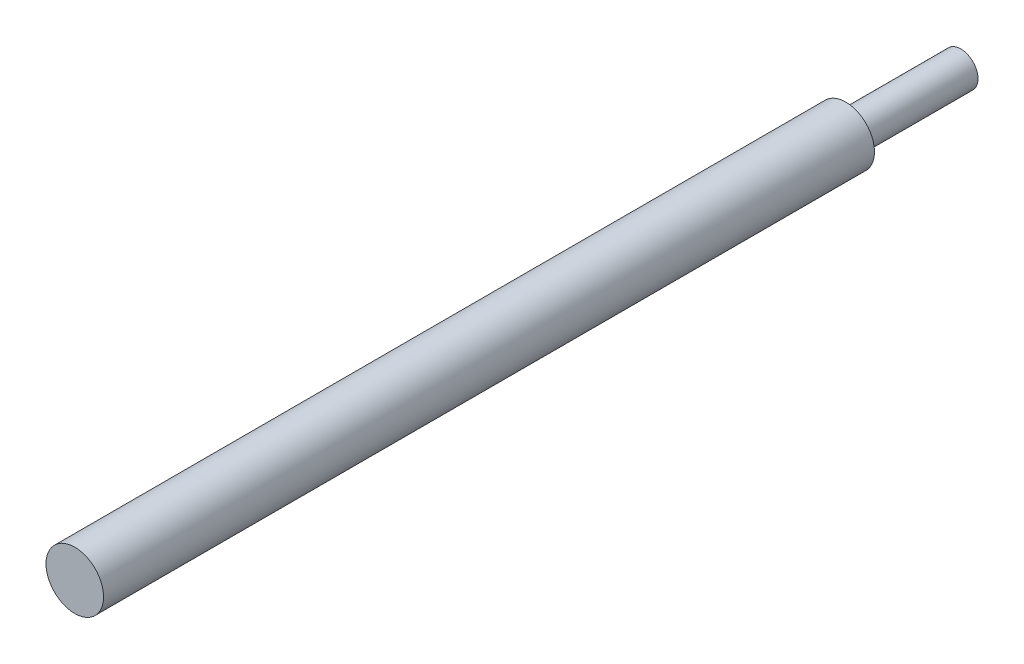
ISO-10303-21;
HEADER;
FILE_DESCRIPTION(('STEP AP214'),'2;1');
FILE_NAME('part.step','',(''),(''),'','','');
FILE_SCHEMA(('AUTOMOTIVE_DESIGN { 1 0 10303 214 1 1 1 1 }'));
ENDSEC;
DATA;
#1=APPLICATION_CONTEXT('core data for automotive mechanical design processes');
#2=APPLICATION_PROTOCOL_DEFINITION('international standard','automotive_design',2000,#1);
#3=PRODUCT_CONTEXT('',#1,'mechanical');
#4=PRODUCT('Part','Part','',(#3));
#5=PRODUCT_RELATED_PRODUCT_CATEGORY('part','',(#4));
#6=PRODUCT_DEFINITION_FORMATION('','',#4);
#7=PRODUCT_DEFINITION_CONTEXT('part definition',#1,'design');
#8=PRODUCT_DEFINITION('design','',#6,#7);
#9=PRODUCT_DEFINITION_SHAPE('','',#8);
#10=(LENGTH_UNIT() NAMED_UNIT(*) SI_UNIT(.MILLI.,.METRE.));
#11=(NAMED_UNIT(*) PLANE_ANGLE_UNIT() SI_UNIT($,.RADIAN.));
#12=(NAMED_UNIT(*) SI_UNIT($,.STERADIAN.) SOLID_ANGLE_UNIT());
#13=UNCERTAINTY_MEASURE_WITH_UNIT(LENGTH_MEASURE(1.E-05),#10,'distance_accuracy_value','');
#14=(GEOMETRIC_REPRESENTATION_CONTEXT(3) GLOBAL_UNCERTAINTY_ASSIGNED_CONTEXT((#13)) GLOBAL_UNIT_ASSIGNED_CONTEXT((#10,
#11,#12)) REPRESENTATION_CONTEXT('',''));
#15=CARTESIAN_POINT('',(0.,0.,0.));
#16=DIRECTION('',(0.,0.,1.));
#17=DIRECTION('',(1.,0.,0.));
#18=AXIS2_PLACEMENT_3D('',#15,#16,#17);
#19=CARTESIAN_POINT('',(0.,0.,77.));
#20=DIRECTION('',(0.,0.,-1.));
#21=DIRECTION('',(-1.,0.,0.));
#22=AXIS2_PLACEMENT_3D('',#19,#20,#21);
#23=CYLINDRICAL_SURFACE('',#22,2.5);
#24=CARTESIAN_POINT('',(0.,0.,77.));
#25=DIRECTION('',(0.,0.,1.));
#26=DIRECTION('',(1.,0.,0.));
#27=AXIS2_PLACEMENT_3D('',#24,#25,#26);
#28=CIRCLE('',#27,2.5);
#29=CARTESIAN_POINT('',(2.5,0.,77.));
#30=VERTEX_POINT('',#29);
#31=EDGE_CURVE('E10',#30,#30,#28,.T.);
#32=ORIENTED_EDGE('',*,*,#31,.F.);
#33=EDGE_LOOP('',(#32));
#34=FACE_BOUND('',#33,.T.);
#35=CARTESIAN_POINT('',(0.,0.,10.));
#36=DIRECTION('',(0.,0.,-1.));
#37=DIRECTION('',(-1.,0.,0.));
#38=AXIS2_PLACEMENT_3D('',#35,#36,#37);
#39=CIRCLE('',#38,2.5);
#40=CARTESIAN_POINT('',(-2.5,0.,10.));
#41=VERTEX_POINT('',#40);
#42=EDGE_CURVE('E36',#41,#41,#39,.T.);
#43=ORIENTED_EDGE('',*,*,#42,.F.);
#44=EDGE_LOOP('',(#43));
#45=FACE_BOUND('',#44,.T.);
#46=ADVANCED_FACE('F30',(#34,#45),#23,.T.);
#47=CARTESIAN_POINT('',(0.,0.,77.));
#48=DIRECTION('',(0.,0.,1.));
#49=DIRECTION('',(1.,0.,0.));
#50=AXIS2_PLACEMENT_3D('',#47,#48,#49);
#51=PLANE('',#50);
#52=ORIENTED_EDGE('',*,*,#31,.T.);
#53=EDGE_LOOP('',(#52));
#54=FACE_BOUND('',#53,.T.);
#55=ADVANCED_FACE('F61',(#54),#51,.T.);
#56=CARTESIAN_POINT('',(0.,0.,10.));
#57=DIRECTION('',(0.,0.,-1.));
#58=DIRECTION('',(-1.,0.,0.));
#59=AXIS2_PLACEMENT_3D('',#56,#57,#58);
#60=PLANE('',#59);
#61=CARTESIAN_POINT('',(0.,0.,10.));
#62=DIRECTION('',(0.,0.,-1.));
#63=DIRECTION('',(-1.,0.,0.));
#64=AXIS2_PLACEMENT_3D('',#61,#62,#63);
#65=CIRCLE('',#64,1.5);
#66=CARTESIAN_POINT('',(-1.5,0.,10.));
#67=VERTEX_POINT('',#66);
#68=EDGE_CURVE('E40',#67,#67,#65,.T.);
#69=ORIENTED_EDGE('',*,*,#68,.F.);
#70=EDGE_LOOP('',(#69));
#71=FACE_BOUND('',#70,.T.);
#72=ORIENTED_EDGE('',*,*,#42,.T.);
#73=EDGE_LOOP('',(#72));
#74=FACE_BOUND('',#73,.T.);
#75=ADVANCED_FACE('F54',(#71,#74),#60,.T.);
#76=CARTESIAN_POINT('',(0.,0.,10.));
#77=DIRECTION('',(0.,0.,-1.));
#78=DIRECTION('',(-1.,0.,0.));
#79=AXIS2_PLACEMENT_3D('',#76,#77,#78);
#80=CYLINDRICAL_SURFACE('',#79,1.5);
#81=ORIENTED_EDGE('',*,*,#68,.T.);
#82=EDGE_LOOP('',(#81));
#83=FACE_BOUND('',#82,.T.);
#84=CARTESIAN_POINT('',(0.,0.,0.));
#85=DIRECTION('',(0.,0.,-1.));
#86=DIRECTION('',(-1.,0.,0.));
#87=AXIS2_PLACEMENT_3D('',#84,#85,#86);
#88=CIRCLE('',#87,1.5);
#89=CARTESIAN_POINT('',(-1.5,0.,0.));
#90=VERTEX_POINT('',#89);
#91=EDGE_CURVE('E44',#90,#90,#88,.T.);
#92=ORIENTED_EDGE('',*,*,#91,.F.);
#93=EDGE_LOOP('',(#92));
#94=FACE_BOUND('',#93,.T.);
#95=ADVANCED_FACE('F52',(#83,#94),#80,.T.);
#96=CARTESIAN_POINT('',(0.,0.,0.));
#97=DIRECTION('',(0.,0.,1.));
#98=DIRECTION('',(1.,0.,0.));
#99=AXIS2_PLACEMENT_3D('',#96,#97,#98);
#100=PLANE('',#99);
#101=ORIENTED_EDGE('',*,*,#91,.T.);
#102=EDGE_LOOP('',(#101));
#103=FACE_BOUND('',#102,.T.);
#104=ADVANCED_FACE('F50',(#103),#100,.F.);
#105=CLOSED_SHELL('',(#46,#55,#75,#95,#104));
#106=MANIFOLD_SOLID_BREP('B2',#105);
#107=ADVANCED_BREP_SHAPE_REPRESENTATION('',(#18,#106),#14);
#108=SHAPE_DEFINITION_REPRESENTATION(#9,#107);
ENDSEC;
END-ISO-10303-21;
